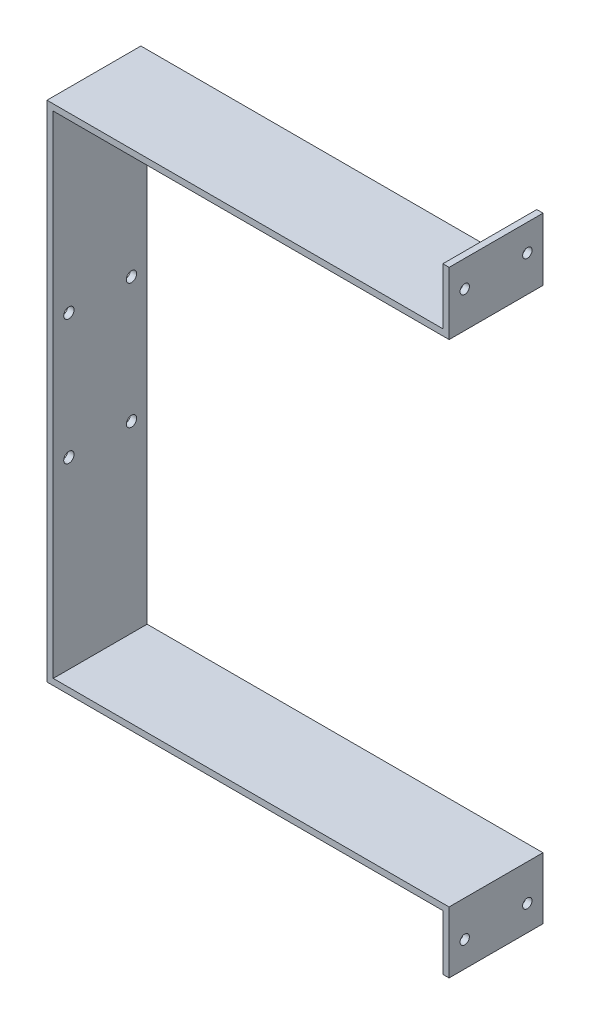
ISO-10303-21;
HEADER;
FILE_DESCRIPTION(('STEP AP214'),'2;1');
FILE_NAME('part.step','',(''),(''),'','','');
FILE_SCHEMA(('AUTOMOTIVE_DESIGN { 1 0 10303 214 1 1 1 1 }'));
ENDSEC;
DATA;
#1=APPLICATION_CONTEXT('core data for automotive mechanical design processes');
#2=APPLICATION_PROTOCOL_DEFINITION('international standard','automotive_design',2000,#1);
#3=PRODUCT_CONTEXT('',#1,'mechanical');
#4=PRODUCT('Part','Part','',(#3));
#5=PRODUCT_RELATED_PRODUCT_CATEGORY('part','',(#4));
#6=PRODUCT_DEFINITION_FORMATION('','',#4);
#7=PRODUCT_DEFINITION_CONTEXT('part definition',#1,'design');
#8=PRODUCT_DEFINITION('design','',#6,#7);
#9=PRODUCT_DEFINITION_SHAPE('','',#8);
#10=(LENGTH_UNIT() NAMED_UNIT(*) SI_UNIT(.MILLI.,.METRE.));
#11=(NAMED_UNIT(*) PLANE_ANGLE_UNIT() SI_UNIT($,.RADIAN.));
#12=(NAMED_UNIT(*) SI_UNIT($,.STERADIAN.) SOLID_ANGLE_UNIT());
#13=UNCERTAINTY_MEASURE_WITH_UNIT(LENGTH_MEASURE(1.E-05),#10,'distance_accuracy_value','');
#14=(GEOMETRIC_REPRESENTATION_CONTEXT(3) GLOBAL_UNCERTAINTY_ASSIGNED_CONTEXT((#13)) GLOBAL_UNIT_ASSIGNED_CONTEXT((#10,
#11,#12)) REPRESENTATION_CONTEXT('',''));
#15=CARTESIAN_POINT('',(0.,0.,0.));
#16=DIRECTION('',(0.,0.,1.));
#17=DIRECTION('',(1.,0.,0.));
#18=AXIS2_PLACEMENT_3D('',#15,#16,#17);
#19=CARTESIAN_POINT('',(0.,0.,30.));
#20=DIRECTION('',(0.,1.,0.));
#21=DIRECTION('',(0.,0.,1.));
#22=AXIS2_PLACEMENT_3D('',#19,#20,#21);
#23=PLANE('',#22);
#24=DIRECTION('',(1.,0.,0.));
#25=VECTOR('',#24,1.);
#26=CARTESIAN_POINT('',(0.,0.,0.));
#27=LINE('',#26,#25);
#28=CARTESIAN_POINT('',(0.,0.,0.));
#29=VERTEX_POINT('',#28);
#30=CARTESIAN_POINT('',(126.5,0.,0.));
#31=VERTEX_POINT('',#30);
#32=EDGE_CURVE('E175',#29,#31,#27,.T.);
#33=ORIENTED_EDGE('',*,*,#32,.T.);
#34=DIRECTION('',(0.,0.,-1.));
#35=VECTOR('',#34,1.);
#36=CARTESIAN_POINT('',(126.5,0.,30.));
#37=LINE('',#36,#35);
#38=CARTESIAN_POINT('',(126.5,0.,30.));
#39=VERTEX_POINT('',#38);
#40=EDGE_CURVE('E11',#39,#31,#37,.T.);
#41=ORIENTED_EDGE('',*,*,#40,.F.);
#42=DIRECTION('',(1.,0.,0.));
#43=VECTOR('',#42,1.);
#44=CARTESIAN_POINT('',(0.,0.,30.));
#45=LINE('',#44,#43);
#46=CARTESIAN_POINT('',(0.,0.,30.));
#47=VERTEX_POINT('',#46);
#48=EDGE_CURVE('E210',#47,#39,#45,.T.);
#49=ORIENTED_EDGE('',*,*,#48,.F.);
#50=DIRECTION('',(0.,0.,-1.));
#51=VECTOR('',#50,1.);
#52=CARTESIAN_POINT('',(0.,0.,30.));
#53=LINE('',#52,#51);
#54=EDGE_CURVE('E171',#47,#29,#53,.T.);
#55=ORIENTED_EDGE('',*,*,#54,.T.);
#56=EDGE_LOOP('',(#33,#41,#49,#55));
#57=FACE_BOUND('',#56,.T.);
#58=ADVANCED_FACE('F17',(#57),#23,.F.);
#59=CARTESIAN_POINT('',(126.5,0.,30.));
#60=DIRECTION('',(-1.,0.,0.));
#61=DIRECTION('',(0.,0.,1.));
#62=AXIS2_PLACEMENT_3D('',#59,#60,#61);
#63=PLANE('',#62);
#64=CARTESIAN_POINT('',(126.5,11.5,5.));
#65=DIRECTION('',(-1.,0.,0.));
#66=DIRECTION('',(0.,0.,1.));
#67=AXIS2_PLACEMENT_3D('',#64,#65,#66);
#68=CIRCLE('',#67,1.5);
#69=CARTESIAN_POINT('',(126.5,11.5,6.5));
#70=VERTEX_POINT('',#69);
#71=EDGE_CURVE('E249',#70,#70,#68,.F.);
#72=ORIENTED_EDGE('',*,*,#71,.F.);
#73=EDGE_LOOP('',(#72));
#74=FACE_BOUND('',#73,.T.);
#75=CARTESIAN_POINT('',(126.5,11.5,25.));
#76=DIRECTION('',(-1.,0.,0.));
#77=DIRECTION('',(0.,0.,1.));
#78=AXIS2_PLACEMENT_3D('',#75,#76,#77);
#79=CIRCLE('',#78,1.5);
#80=CARTESIAN_POINT('',(126.5,11.5,26.5));
#81=VERTEX_POINT('',#80);
#82=EDGE_CURVE('E257',#81,#81,#79,.F.);
#83=ORIENTED_EDGE('',*,*,#82,.F.);
#84=EDGE_LOOP('',(#83));
#85=FACE_BOUND('',#84,.T.);
#86=DIRECTION('',(0.,1.,0.));
#87=VECTOR('',#86,1.);
#88=CARTESIAN_POINT('',(126.5,0.,0.));
#89=LINE('',#88,#87);
#90=CARTESIAN_POINT('',(126.5,20.,0.));
#91=VERTEX_POINT('',#90);
#92=EDGE_CURVE('E179',#31,#91,#89,.T.);
#93=ORIENTED_EDGE('',*,*,#92,.T.);
#94=DIRECTION('',(0.,0.,-1.));
#95=VECTOR('',#94,1.);
#96=CARTESIAN_POINT('',(126.5,20.,30.));
#97=LINE('',#96,#95);
#98=CARTESIAN_POINT('',(126.5,20.,30.));
#99=VERTEX_POINT('',#98);
#100=EDGE_CURVE('E27',#99,#91,#97,.T.);
#101=ORIENTED_EDGE('',*,*,#100,.F.);
#102=DIRECTION('',(0.,1.,0.));
#103=VECTOR('',#102,1.);
#104=CARTESIAN_POINT('',(126.5,0.,30.));
#105=LINE('',#104,#103);
#106=EDGE_CURVE('E112',#39,#99,#105,.T.);
#107=ORIENTED_EDGE('',*,*,#106,.F.);
#108=ORIENTED_EDGE('',*,*,#40,.T.);
#109=EDGE_LOOP('',(#93,#101,#107,#108));
#110=FACE_BOUND('',#109,.T.);
#111=ADVANCED_FACE('F409',(#74,#85,#110),#63,.F.);
#112=CARTESIAN_POINT('',(124.5,20.,30.));
#113=DIRECTION('',(0.,-1.,0.));
#114=DIRECTION('',(0.,0.,-1.));
#115=AXIS2_PLACEMENT_3D('',#112,#113,#114);
#116=PLANE('',#115);
#117=DIRECTION('',(-1.,0.,0.));
#118=VECTOR('',#117,1.);
#119=CARTESIAN_POINT('',(124.5,20.,0.));
#120=LINE('',#119,#118);
#121=CARTESIAN_POINT('',(124.5,20.,0.));
#122=VERTEX_POINT('',#121);
#123=EDGE_CURVE('E183',#91,#122,#120,.T.);
#124=ORIENTED_EDGE('',*,*,#123,.T.);
#125=DIRECTION('',(0.,0.,-1.));
#126=VECTOR('',#125,1.);
#127=CARTESIAN_POINT('',(124.5,20.,30.));
#128=LINE('',#127,#126);
#129=CARTESIAN_POINT('',(124.5,20.,30.));
#130=VERTEX_POINT('',#129);
#131=EDGE_CURVE('E237',#130,#122,#128,.T.);
#132=ORIENTED_EDGE('',*,*,#131,.F.);
#133=DIRECTION('',(-1.,0.,0.));
#134=VECTOR('',#133,1.);
#135=CARTESIAN_POINT('',(124.5,20.,30.));
#136=LINE('',#135,#134);
#137=EDGE_CURVE('E312',#99,#130,#136,.T.);
#138=ORIENTED_EDGE('',*,*,#137,.F.);
#139=ORIENTED_EDGE('',*,*,#100,.T.);
#140=EDGE_LOOP('',(#124,#132,#138,#139));
#141=FACE_BOUND('',#140,.T.);
#142=ADVANCED_FACE('F378',(#141),#116,.F.);
#143=CARTESIAN_POINT('',(124.5,2.,30.));
#144=DIRECTION('',(1.,0.,0.));
#145=DIRECTION('',(0.,0.,-1.));
#146=AXIS2_PLACEMENT_3D('',#143,#144,#145);
#147=PLANE('',#146);
#148=CARTESIAN_POINT('',(124.5,11.5,5.));
#149=DIRECTION('',(1.,0.,0.));
#150=DIRECTION('',(0.,0.,-1.));
#151=AXIS2_PLACEMENT_3D('',#148,#149,#150);
#152=CIRCLE('',#151,1.5);
#153=CARTESIAN_POINT('',(124.5,11.5,3.5));
#154=VERTEX_POINT('',#153);
#155=EDGE_CURVE('E20',#154,#154,#152,.F.);
#156=ORIENTED_EDGE('',*,*,#155,.F.);
#157=EDGE_LOOP('',(#156));
#158=FACE_BOUND('',#157,.T.);
#159=CARTESIAN_POINT('',(124.5,11.5,25.));
#160=DIRECTION('',(1.,0.,0.));
#161=DIRECTION('',(0.,0.,-1.));
#162=AXIS2_PLACEMENT_3D('',#159,#160,#161);
#163=CIRCLE('',#162,1.5);
#164=CARTESIAN_POINT('',(124.5,11.5,23.5));
#165=VERTEX_POINT('',#164);
#166=EDGE_CURVE('E254',#165,#165,#163,.F.);
#167=ORIENTED_EDGE('',*,*,#166,.F.);
#168=EDGE_LOOP('',(#167));
#169=FACE_BOUND('',#168,.T.);
#170=DIRECTION('',(0.,-1.,0.));
#171=VECTOR('',#170,1.);
#172=CARTESIAN_POINT('',(124.5,2.,0.));
#173=LINE('',#172,#171);
#174=CARTESIAN_POINT('',(124.5,2.,0.));
#175=VERTEX_POINT('',#174);
#176=EDGE_CURVE('E186',#122,#175,#173,.T.);
#177=ORIENTED_EDGE('',*,*,#176,.T.);
#178=DIRECTION('',(0.,0.,-1.));
#179=VECTOR('',#178,1.);
#180=CARTESIAN_POINT('',(124.5,2.,30.));
#181=LINE('',#180,#179);
#182=CARTESIAN_POINT('',(124.5,2.,30.));
#183=VERTEX_POINT('',#182);
#184=EDGE_CURVE('E233',#183,#175,#181,.T.);
#185=ORIENTED_EDGE('',*,*,#184,.F.);
#186=DIRECTION('',(0.,-1.,0.));
#187=VECTOR('',#186,1.);
#188=CARTESIAN_POINT('',(124.5,2.,30.));
#189=LINE('',#188,#187);
#190=EDGE_CURVE('E315',#130,#183,#189,.T.);
#191=ORIENTED_EDGE('',*,*,#190,.F.);
#192=ORIENTED_EDGE('',*,*,#131,.T.);
#193=EDGE_LOOP('',(#177,#185,#191,#192));
#194=FACE_BOUND('',#193,.T.);
#195=ADVANCED_FACE('F374',(#158,#169,#194),#147,.F.);
#196=CARTESIAN_POINT('',(-2.,2.,30.));
#197=DIRECTION('',(0.,-1.,0.));
#198=DIRECTION('',(0.,0.,-1.));
#199=AXIS2_PLACEMENT_3D('',#196,#197,#198);
#200=PLANE('',#199);
#201=DIRECTION('',(-1.,0.,0.));
#202=VECTOR('',#201,1.);
#203=CARTESIAN_POINT('',(-2.,2.,0.));
#204=LINE('',#203,#202);
#205=CARTESIAN_POINT('',(-2.,2.,0.));
#206=VERTEX_POINT('',#205);
#207=EDGE_CURVE('E189',#175,#206,#204,.T.);
#208=ORIENTED_EDGE('',*,*,#207,.T.);
#209=DIRECTION('',(0.,0.,-1.));
#210=VECTOR('',#209,1.);
#211=CARTESIAN_POINT('',(-2.,2.,30.));
#212=LINE('',#211,#210);
#213=CARTESIAN_POINT('',(-2.,2.,30.));
#214=VERTEX_POINT('',#213);
#215=EDGE_CURVE('E229',#214,#206,#212,.T.);
#216=ORIENTED_EDGE('',*,*,#215,.F.);
#217=DIRECTION('',(-1.,0.,0.));
#218=VECTOR('',#217,1.);
#219=CARTESIAN_POINT('',(-2.,2.,30.));
#220=LINE('',#219,#218);
#221=EDGE_CURVE('E318',#183,#214,#220,.T.);
#222=ORIENTED_EDGE('',*,*,#221,.F.);
#223=ORIENTED_EDGE('',*,*,#184,.T.);
#224=EDGE_LOOP('',(#208,#216,#222,#223));
#225=FACE_BOUND('',#224,.T.);
#226=ADVANCED_FACE('F377',(#225),#200,.F.);
#227=CARTESIAN_POINT('',(-2.,2.,30.));
#228=DIRECTION('',(1.,0.,0.));
#229=DIRECTION('',(0.,1.,0.));
#230=AXIS2_PLACEMENT_3D('',#227,#228,#229);
#231=PLANE('',#230);
#232=CARTESIAN_POINT('',(-2.,-98.3324832100896,25.));
#233=DIRECTION('',(1.,0.,0.));
#234=DIRECTION('',(0.,1.,0.));
#235=AXIS2_PLACEMENT_3D('',#232,#233,#234);
#236=CIRCLE('',#235,1.65);
#237=CARTESIAN_POINT('',(-2.,-96.6824832100896,25.));
#238=VERTEX_POINT('',#237);
#239=EDGE_CURVE('E297',#238,#238,#236,.T.);
#240=ORIENTED_EDGE('',*,*,#239,.T.);
#241=EDGE_LOOP('',(#240));
#242=FACE_BOUND('',#241,.T.);
#243=CARTESIAN_POINT('',(-2.,-58.3324832100896,25.));
#244=DIRECTION('',(1.,0.,0.));
#245=DIRECTION('',(0.,1.,0.));
#246=AXIS2_PLACEMENT_3D('',#243,#244,#245);
#247=CIRCLE('',#246,1.65);
#248=CARTESIAN_POINT('',(-2.,-56.6824832100896,25.));
#249=VERTEX_POINT('',#248);
#250=EDGE_CURVE('E293',#249,#249,#247,.T.);
#251=ORIENTED_EDGE('',*,*,#250,.T.);
#252=EDGE_LOOP('',(#251));
#253=FACE_BOUND('',#252,.T.);
#254=CARTESIAN_POINT('',(-2.,-58.3324832100896,5.));
#255=DIRECTION('',(1.,0.,0.));
#256=DIRECTION('',(0.,1.,0.));
#257=AXIS2_PLACEMENT_3D('',#254,#255,#256);
#258=CIRCLE('',#257,1.65);
#259=CARTESIAN_POINT('',(-2.,-56.6824832100896,5.));
#260=VERTEX_POINT('',#259);
#261=EDGE_CURVE('E282',#260,#260,#258,.T.);
#262=ORIENTED_EDGE('',*,*,#261,.T.);
#263=EDGE_LOOP('',(#262));
#264=FACE_BOUND('',#263,.T.);
#265=CARTESIAN_POINT('',(-2.,-98.3324832100896,5.));
#266=DIRECTION('',(1.,0.,0.));
#267=DIRECTION('',(0.,1.,0.));
#268=AXIS2_PLACEMENT_3D('',#265,#266,#267);
#269=CIRCLE('',#268,1.65);
#270=CARTESIAN_POINT('',(-2.,-96.6824832100896,5.));
#271=VERTEX_POINT('',#270);
#272=EDGE_CURVE('E180',#271,#271,#269,.T.);
#273=ORIENTED_EDGE('',*,*,#272,.T.);
#274=EDGE_LOOP('',(#273));
#275=FACE_BOUND('',#274,.T.);
#276=DIRECTION('',(0.,-1.,0.));
#277=VECTOR('',#276,1.);
#278=CARTESIAN_POINT('',(-2.,2.,0.));
#279=LINE('',#278,#277);
#280=CARTESIAN_POINT('',(-2.,-159.,0.));
#281=VERTEX_POINT('',#280);
#282=EDGE_CURVE('E192',#206,#281,#279,.T.);
#283=ORIENTED_EDGE('',*,*,#282,.T.);
#284=DIRECTION('',(0.,0.,-1.));
#285=VECTOR('',#284,1.);
#286=CARTESIAN_POINT('',(-2.,-159.,30.));
#287=LINE('',#286,#285);
#288=CARTESIAN_POINT('',(-2.,-159.,30.));
#289=VERTEX_POINT('',#288);
#290=EDGE_CURVE('E225',#289,#281,#287,.T.);
#291=ORIENTED_EDGE('',*,*,#290,.F.);
#292=DIRECTION('',(0.,-1.,0.));
#293=VECTOR('',#292,1.);
#294=CARTESIAN_POINT('',(-2.,2.,30.));
#295=LINE('',#294,#293);
#296=EDGE_CURVE('E321',#214,#289,#295,.T.);
#297=ORIENTED_EDGE('',*,*,#296,.F.);
#298=ORIENTED_EDGE('',*,*,#215,.T.);
#299=EDGE_LOOP('',(#283,#291,#297,#298));
#300=FACE_BOUND('',#299,.T.);
#301=ADVANCED_FACE('F398',(#242,#253,#264,#275,#300),#231,.F.);
#302=CARTESIAN_POINT('',(-2.,-159.,30.));
#303=DIRECTION('',(0.,1.,0.));
#304=DIRECTION('',(0.,0.,1.));
#305=AXIS2_PLACEMENT_3D('',#302,#303,#304);
#306=PLANE('',#305);
#307=DIRECTION('',(1.,0.,0.));
#308=VECTOR('',#307,1.);
#309=CARTESIAN_POINT('',(-2.,-159.,0.));
#310=LINE('',#309,#308);
#311=CARTESIAN_POINT('',(124.48,-159.,0.));
#312=VERTEX_POINT('',#311);
#313=EDGE_CURVE('E195',#281,#312,#310,.T.);
#314=ORIENTED_EDGE('',*,*,#313,.T.);
#315=DIRECTION('',(0.,0.,-1.));
#316=VECTOR('',#315,1.);
#317=CARTESIAN_POINT('',(124.48,-159.,30.));
#318=LINE('',#317,#316);
#319=CARTESIAN_POINT('',(124.48,-159.,30.));
#320=VERTEX_POINT('',#319);
#321=EDGE_CURVE('E221',#320,#312,#318,.T.);
#322=ORIENTED_EDGE('',*,*,#321,.F.);
#323=DIRECTION('',(1.,0.,0.));
#324=VECTOR('',#323,1.);
#325=CARTESIAN_POINT('',(-2.,-159.,30.));
#326=LINE('',#325,#324);
#327=EDGE_CURVE('E324',#289,#320,#326,.T.);
#328=ORIENTED_EDGE('',*,*,#327,.F.);
#329=ORIENTED_EDGE('',*,*,#290,.T.);
#330=EDGE_LOOP('',(#314,#322,#328,#329));
#331=FACE_BOUND('',#330,.T.);
#332=ADVANCED_FACE('F402',(#331),#306,.F.);
#333=CARTESIAN_POINT('',(124.48,-159.,30.));
#334=DIRECTION('',(1.,0.,0.));
#335=DIRECTION('',(0.,0.,-1.));
#336=AXIS2_PLACEMENT_3D('',#333,#334,#335);
#337=PLANE('',#336);
#338=CARTESIAN_POINT('',(124.48,-168.5,25.));
#339=DIRECTION('',(1.,0.,0.));
#340=DIRECTION('',(0.,0.,-1.));
#341=AXIS2_PLACEMENT_3D('',#338,#339,#340);
#342=CIRCLE('',#341,1.5);
#343=CARTESIAN_POINT('',(124.48,-168.5,23.5));
#344=VERTEX_POINT('',#343);
#345=EDGE_CURVE('E253',#344,#344,#342,.F.);
#346=ORIENTED_EDGE('',*,*,#345,.F.);
#347=EDGE_LOOP('',(#346));
#348=FACE_BOUND('',#347,.T.);
#349=CARTESIAN_POINT('',(124.48,-168.5,5.));
#350=DIRECTION('',(1.,0.,0.));
#351=DIRECTION('',(0.,0.,-1.));
#352=AXIS2_PLACEMENT_3D('',#349,#350,#351);
#353=CIRCLE('',#352,1.5);
#354=CARTESIAN_POINT('',(124.48,-168.5,3.5));
#355=VERTEX_POINT('',#354);
#356=EDGE_CURVE('E248',#355,#355,#353,.F.);
#357=ORIENTED_EDGE('',*,*,#356,.F.);
#358=EDGE_LOOP('',(#357));
#359=FACE_BOUND('',#358,.T.);
#360=DIRECTION('',(0.,-1.,0.));
#361=VECTOR('',#360,1.);
#362=CARTESIAN_POINT('',(124.48,-159.,0.));
#363=LINE('',#362,#361);
#364=CARTESIAN_POINT('',(124.48,-176.664966420179,0.));
#365=VERTEX_POINT('',#364);
#366=EDGE_CURVE('E198',#312,#365,#363,.T.);
#367=ORIENTED_EDGE('',*,*,#366,.T.);
#368=DIRECTION('',(0.,0.,-1.));
#369=VECTOR('',#368,1.);
#370=CARTESIAN_POINT('',(124.48,-176.664966420179,30.));
#371=LINE('',#370,#369);
#372=CARTESIAN_POINT('',(124.48,-176.664966420179,30.));
#373=VERTEX_POINT('',#372);
#374=EDGE_CURVE('E217',#373,#365,#371,.T.);
#375=ORIENTED_EDGE('',*,*,#374,.F.);
#376=DIRECTION('',(0.,-1.,0.));
#377=VECTOR('',#376,1.);
#378=CARTESIAN_POINT('',(124.48,-159.,30.));
#379=LINE('',#378,#377);
#380=EDGE_CURVE('E327',#320,#373,#379,.T.);
#381=ORIENTED_EDGE('',*,*,#380,.F.);
#382=ORIENTED_EDGE('',*,*,#321,.T.);
#383=EDGE_LOOP('',(#367,#375,#381,#382));
#384=FACE_BOUND('',#383,.T.);
#385=ADVANCED_FACE('F417',(#348,#359,#384),#337,.F.);
#386=CARTESIAN_POINT('',(124.48,-176.664966420179,30.));
#387=DIRECTION('',(0.,1.,0.));
#388=DIRECTION('',(0.,0.,1.));
#389=AXIS2_PLACEMENT_3D('',#386,#387,#388);
#390=PLANE('',#389);
#391=DIRECTION('',(1.,0.,0.));
#392=VECTOR('',#391,1.);
#393=CARTESIAN_POINT('',(124.48,-176.664966420179,0.));
#394=LINE('',#393,#392);
#395=CARTESIAN_POINT('',(126.48,-176.664966420179,0.));
#396=VERTEX_POINT('',#395);
#397=EDGE_CURVE('E201',#365,#396,#394,.T.);
#398=ORIENTED_EDGE('',*,*,#397,.T.);
#399=DIRECTION('',(0.,0.,-1.));
#400=VECTOR('',#399,1.);
#401=CARTESIAN_POINT('',(126.48,-176.664966420179,30.));
#402=LINE('',#401,#400);
#403=CARTESIAN_POINT('',(126.48,-176.664966420179,30.));
#404=VERTEX_POINT('',#403);
#405=EDGE_CURVE('E163',#404,#396,#402,.T.);
#406=ORIENTED_EDGE('',*,*,#405,.F.);
#407=DIRECTION('',(1.,0.,0.));
#408=VECTOR('',#407,1.);
#409=CARTESIAN_POINT('',(124.48,-176.664966420179,30.));
#410=LINE('',#409,#408);
#411=EDGE_CURVE('E152',#373,#404,#410,.T.);
#412=ORIENTED_EDGE('',*,*,#411,.F.);
#413=ORIENTED_EDGE('',*,*,#374,.T.);
#414=EDGE_LOOP('',(#398,#406,#412,#413));
#415=FACE_BOUND('',#414,.T.);
#416=ADVANCED_FACE('F415',(#415),#390,.F.);
#417=CARTESIAN_POINT('',(126.48,-157.,30.));
#418=DIRECTION('',(-1.,0.,0.));
#419=DIRECTION('',(0.,0.,1.));
#420=AXIS2_PLACEMENT_3D('',#417,#418,#419);
#421=PLANE('',#420);
#422=CARTESIAN_POINT('',(126.48,-168.5,25.));
#423=DIRECTION('',(-1.,0.,0.));
#424=DIRECTION('',(0.,0.,1.));
#425=AXIS2_PLACEMENT_3D('',#422,#423,#424);
#426=CIRCLE('',#425,1.5);
#427=CARTESIAN_POINT('',(126.48,-168.5,26.5));
#428=VERTEX_POINT('',#427);
#429=EDGE_CURVE('E250',#428,#428,#426,.F.);
#430=ORIENTED_EDGE('',*,*,#429,.F.);
#431=EDGE_LOOP('',(#430));
#432=FACE_BOUND('',#431,.T.);
#433=CARTESIAN_POINT('',(126.48,-168.5,5.));
#434=DIRECTION('',(-1.,0.,0.));
#435=DIRECTION('',(0.,0.,1.));
#436=AXIS2_PLACEMENT_3D('',#433,#434,#435);
#437=CIRCLE('',#436,1.5);
#438=CARTESIAN_POINT('',(126.48,-168.5,6.5));
#439=VERTEX_POINT('',#438);
#440=EDGE_CURVE('E244',#439,#439,#437,.F.);
#441=ORIENTED_EDGE('',*,*,#440,.F.);
#442=EDGE_LOOP('',(#441));
#443=FACE_BOUND('',#442,.T.);
#444=DIRECTION('',(0.,1.,0.));
#445=VECTOR('',#444,1.);
#446=CARTESIAN_POINT('',(126.48,-157.,0.));
#447=LINE('',#446,#445);
#448=CARTESIAN_POINT('',(126.48,-157.,0.));
#449=VERTEX_POINT('',#448);
#450=EDGE_CURVE('E161',#396,#449,#447,.T.);
#451=ORIENTED_EDGE('',*,*,#450,.T.);
#452=DIRECTION('',(0.,0.,-1.));
#453=VECTOR('',#452,1.);
#454=CARTESIAN_POINT('',(126.48,-157.,30.));
#455=LINE('',#454,#453);
#456=CARTESIAN_POINT('',(126.48,-157.,30.));
#457=VERTEX_POINT('',#456);
#458=EDGE_CURVE('E158',#457,#449,#455,.T.);
#459=ORIENTED_EDGE('',*,*,#458,.F.);
#460=DIRECTION('',(0.,1.,0.));
#461=VECTOR('',#460,1.);
#462=CARTESIAN_POINT('',(126.48,-157.,30.));
#463=LINE('',#462,#461);
#464=EDGE_CURVE('E146',#404,#457,#463,.T.);
#465=ORIENTED_EDGE('',*,*,#464,.F.);
#466=ORIENTED_EDGE('',*,*,#405,.T.);
#467=EDGE_LOOP('',(#451,#459,#465,#466));
#468=FACE_BOUND('',#467,.T.);
#469=ADVANCED_FACE('F159',(#432,#443,#468),#421,.F.);
#470=CARTESIAN_POINT('',(0.,-157.,30.));
#471=DIRECTION('',(0.,-1.,0.));
#472=DIRECTION('',(0.,0.,-1.));
#473=AXIS2_PLACEMENT_3D('',#470,#471,#472);
#474=PLANE('',#473);
#475=DIRECTION('',(-1.,0.,0.));
#476=VECTOR('',#475,1.);
#477=CARTESIAN_POINT('',(0.,-157.,0.));
#478=LINE('',#477,#476);
#479=CARTESIAN_POINT('',(0.,-157.,0.));
#480=VERTEX_POINT('',#479);
#481=EDGE_CURVE('E94',#449,#480,#478,.T.);
#482=ORIENTED_EDGE('',*,*,#481,.T.);
#483=DIRECTION('',(0.,0.,-1.));
#484=VECTOR('',#483,1.);
#485=CARTESIAN_POINT('',(0.,-157.,30.));
#486=LINE('',#485,#484);
#487=CARTESIAN_POINT('',(0.,-157.,30.));
#488=VERTEX_POINT('',#487);
#489=EDGE_CURVE('E164',#488,#480,#486,.T.);
#490=ORIENTED_EDGE('',*,*,#489,.F.);
#491=DIRECTION('',(-1.,0.,0.));
#492=VECTOR('',#491,1.);
#493=CARTESIAN_POINT('',(0.,-157.,30.));
#494=LINE('',#493,#492);
#495=EDGE_CURVE('E150',#457,#488,#494,.T.);
#496=ORIENTED_EDGE('',*,*,#495,.F.);
#497=ORIENTED_EDGE('',*,*,#458,.T.);
#498=EDGE_LOOP('',(#482,#490,#496,#497));
#499=FACE_BOUND('',#498,.T.);
#500=ADVANCED_FACE('F166',(#499),#474,.F.);
#501=CARTESIAN_POINT('',(0.,0.,30.));
#502=DIRECTION('',(-1.,0.,0.));
#503=DIRECTION('',(0.,-1.,0.));
#504=AXIS2_PLACEMENT_3D('',#501,#502,#503);
#505=PLANE('',#504);
#506=CARTESIAN_POINT('',(0.,-98.3324832100896,25.));
#507=DIRECTION('',(1.,0.,0.));
#508=DIRECTION('',(0.,0.,-1.));
#509=AXIS2_PLACEMENT_3D('',#506,#507,#508);
#510=CIRCLE('',#509,1.65);
#511=CARTESIAN_POINT('',(0.,-98.3324832100896,23.35));
#512=VERTEX_POINT('',#511);
#513=EDGE_CURVE('E278',#512,#512,#510,.T.);
#514=ORIENTED_EDGE('',*,*,#513,.F.);
#515=EDGE_LOOP('',(#514));
#516=FACE_BOUND('',#515,.T.);
#517=CARTESIAN_POINT('',(0.,-58.3324832100896,25.));
#518=DIRECTION('',(1.,0.,0.));
#519=DIRECTION('',(0.,0.,-1.));
#520=AXIS2_PLACEMENT_3D('',#517,#518,#519);
#521=CIRCLE('',#520,1.65);
#522=CARTESIAN_POINT('',(0.,-58.3324832100896,23.35));
#523=VERTEX_POINT('',#522);
#524=EDGE_CURVE('E283',#523,#523,#521,.T.);
#525=ORIENTED_EDGE('',*,*,#524,.F.);
#526=EDGE_LOOP('',(#525));
#527=FACE_BOUND('',#526,.T.);
#528=CARTESIAN_POINT('',(0.,-58.3324832100896,5.));
#529=DIRECTION('',(1.,0.,0.));
#530=DIRECTION('',(0.,0.,-1.));
#531=AXIS2_PLACEMENT_3D('',#528,#529,#530);
#532=CIRCLE('',#531,1.65);
#533=CARTESIAN_POINT('',(0.,-58.3324832100896,3.35));
#534=VERTEX_POINT('',#533);
#535=EDGE_CURVE('E277',#534,#534,#532,.T.);
#536=ORIENTED_EDGE('',*,*,#535,.F.);
#537=EDGE_LOOP('',(#536));
#538=FACE_BOUND('',#537,.T.);
#539=CARTESIAN_POINT('',(0.,-98.3324832100896,5.));
#540=DIRECTION('',(1.,0.,0.));
#541=DIRECTION('',(0.,0.,-1.));
#542=AXIS2_PLACEMENT_3D('',#539,#540,#541);
#543=CIRCLE('',#542,1.65);
#544=CARTESIAN_POINT('',(0.,-98.3324832100896,3.35));
#545=VERTEX_POINT('',#544);
#546=EDGE_CURVE('E301',#545,#545,#543,.T.);
#547=ORIENTED_EDGE('',*,*,#546,.F.);
#548=EDGE_LOOP('',(#547));
#549=FACE_BOUND('',#548,.T.);
#550=DIRECTION('',(0.,1.,0.));
#551=VECTOR('',#550,1.);
#552=CARTESIAN_POINT('',(0.,0.,0.));
#553=LINE('',#552,#551);
#554=EDGE_CURVE('E102',#480,#29,#553,.T.);
#555=ORIENTED_EDGE('',*,*,#554,.T.);
#556=ORIENTED_EDGE('',*,*,#54,.F.);
#557=DIRECTION('',(0.,1.,0.));
#558=VECTOR('',#557,1.);
#559=CARTESIAN_POINT('',(0.,0.,30.));
#560=LINE('',#559,#558);
#561=EDGE_CURVE('E40',#488,#47,#560,.T.);
#562=ORIENTED_EDGE('',*,*,#561,.F.);
#563=ORIENTED_EDGE('',*,*,#489,.T.);
#564=EDGE_LOOP('',(#555,#556,#562,#563));
#565=FACE_BOUND('',#564,.T.);
#566=ADVANCED_FACE('F412',(#516,#527,#538,#549,#565),#505,.F.);
#567=CARTESIAN_POINT('',(0.,0.,30.));
#568=DIRECTION('',(0.,0.,1.));
#569=DIRECTION('',(1.,0.,0.));
#570=AXIS2_PLACEMENT_3D('',#567,#568,#569);
#571=PLANE('',#570);
#572=ORIENTED_EDGE('',*,*,#48,.T.);
#573=ORIENTED_EDGE('',*,*,#106,.T.);
#574=ORIENTED_EDGE('',*,*,#137,.T.);
#575=ORIENTED_EDGE('',*,*,#190,.T.);
#576=ORIENTED_EDGE('',*,*,#221,.T.);
#577=ORIENTED_EDGE('',*,*,#296,.T.);
#578=ORIENTED_EDGE('',*,*,#327,.T.);
#579=ORIENTED_EDGE('',*,*,#380,.T.);
#580=ORIENTED_EDGE('',*,*,#411,.T.);
#581=ORIENTED_EDGE('',*,*,#464,.T.);
#582=ORIENTED_EDGE('',*,*,#495,.T.);
#583=ORIENTED_EDGE('',*,*,#561,.T.);
#584=EDGE_LOOP('',(#572,#573,#574,#575,#576,#577,#578,#579,#580,#581,#582,#583));
#585=FACE_BOUND('',#584,.T.);
#586=ADVANCED_FACE('F148',(#585),#571,.T.);
#587=CARTESIAN_POINT('',(0.,0.,0.));
#588=DIRECTION('',(0.,0.,1.));
#589=DIRECTION('',(1.,0.,0.));
#590=AXIS2_PLACEMENT_3D('',#587,#588,#589);
#591=PLANE('',#590);
#592=ORIENTED_EDGE('',*,*,#32,.F.);
#593=ORIENTED_EDGE('',*,*,#554,.F.);
#594=ORIENTED_EDGE('',*,*,#481,.F.);
#595=ORIENTED_EDGE('',*,*,#450,.F.);
#596=ORIENTED_EDGE('',*,*,#397,.F.);
#597=ORIENTED_EDGE('',*,*,#366,.F.);
#598=ORIENTED_EDGE('',*,*,#313,.F.);
#599=ORIENTED_EDGE('',*,*,#282,.F.);
#600=ORIENTED_EDGE('',*,*,#207,.F.);
#601=ORIENTED_EDGE('',*,*,#176,.F.);
#602=ORIENTED_EDGE('',*,*,#123,.F.);
#603=ORIENTED_EDGE('',*,*,#92,.F.);
#604=EDGE_LOOP('',(#592,#593,#594,#595,#596,#597,#598,#599,#600,#601,#602,#603));
#605=FACE_BOUND('',#604,.T.);
#606=ADVANCED_FACE('F393',(#605),#591,.F.);
#607=CARTESIAN_POINT('',(-40.,-98.3324832100896,5.));
#608=DIRECTION('',(1.,0.,0.));
#609=DIRECTION('',(0.,0.,-1.));
#610=AXIS2_PLACEMENT_3D('',#607,#608,#609);
#611=CYLINDRICAL_SURFACE('',#610,1.65);
#612=ORIENTED_EDGE('',*,*,#546,.T.);
#613=EDGE_LOOP('',(#612));
#614=FACE_BOUND('',#613,.T.);
#615=ORIENTED_EDGE('',*,*,#272,.F.);
#616=EDGE_LOOP('',(#615));
#617=FACE_BOUND('',#616,.T.);
#618=ADVANCED_FACE('F455',(#614,#617),#611,.F.);
#619=CARTESIAN_POINT('',(-40.,-58.3324832100896,5.));
#620=DIRECTION('',(1.,0.,0.));
#621=DIRECTION('',(0.,0.,-1.));
#622=AXIS2_PLACEMENT_3D('',#619,#620,#621);
#623=CYLINDRICAL_SURFACE('',#622,1.65);
#624=ORIENTED_EDGE('',*,*,#535,.T.);
#625=EDGE_LOOP('',(#624));
#626=FACE_BOUND('',#625,.T.);
#627=ORIENTED_EDGE('',*,*,#261,.F.);
#628=EDGE_LOOP('',(#627));
#629=FACE_BOUND('',#628,.T.);
#630=ADVANCED_FACE('F457',(#626,#629),#623,.F.);
#631=CARTESIAN_POINT('',(-40.,-58.3324832100896,25.));
#632=DIRECTION('',(1.,0.,0.));
#633=DIRECTION('',(0.,0.,-1.));
#634=AXIS2_PLACEMENT_3D('',#631,#632,#633);
#635=CYLINDRICAL_SURFACE('',#634,1.65);
#636=ORIENTED_EDGE('',*,*,#524,.T.);
#637=EDGE_LOOP('',(#636));
#638=FACE_BOUND('',#637,.T.);
#639=ORIENTED_EDGE('',*,*,#250,.F.);
#640=EDGE_LOOP('',(#639));
#641=FACE_BOUND('',#640,.T.);
#642=ADVANCED_FACE('F464',(#638,#641),#635,.F.);
#643=CARTESIAN_POINT('',(-40.,-98.3324832100896,25.));
#644=DIRECTION('',(1.,0.,0.));
#645=DIRECTION('',(0.,0.,-1.));
#646=AXIS2_PLACEMENT_3D('',#643,#644,#645);
#647=CYLINDRICAL_SURFACE('',#646,1.65);
#648=ORIENTED_EDGE('',*,*,#513,.T.);
#649=EDGE_LOOP('',(#648));
#650=FACE_BOUND('',#649,.T.);
#651=ORIENTED_EDGE('',*,*,#239,.F.);
#652=EDGE_LOOP('',(#651));
#653=FACE_BOUND('',#652,.T.);
#654=ADVANCED_FACE('F489',(#650,#653),#647,.F.);
#655=CARTESIAN_POINT('',(114.5,-168.5,5.));
#656=DIRECTION('',(1.,0.,0.));
#657=DIRECTION('',(0.,0.,-1.));
#658=AXIS2_PLACEMENT_3D('',#655,#656,#657);
#659=CYLINDRICAL_SURFACE('',#658,1.5);
#660=ORIENTED_EDGE('',*,*,#440,.T.);
#661=EDGE_LOOP('',(#660));
#662=FACE_BOUND('',#661,.T.);
#663=ORIENTED_EDGE('',*,*,#356,.T.);
#664=EDGE_LOOP('',(#663));
#665=FACE_BOUND('',#664,.T.);
#666=ADVANCED_FACE('F485',(#662,#665),#659,.F.);
#667=CARTESIAN_POINT('',(114.5,-168.5,25.));
#668=DIRECTION('',(1.,0.,0.));
#669=DIRECTION('',(0.,0.,-1.));
#670=AXIS2_PLACEMENT_3D('',#667,#668,#669);
#671=CYLINDRICAL_SURFACE('',#670,1.5);
#672=ORIENTED_EDGE('',*,*,#429,.T.);
#673=EDGE_LOOP('',(#672));
#674=FACE_BOUND('',#673,.T.);
#675=ORIENTED_EDGE('',*,*,#345,.T.);
#676=EDGE_LOOP('',(#675));
#677=FACE_BOUND('',#676,.T.);
#678=ADVANCED_FACE('F488',(#674,#677),#671,.F.);
#679=CARTESIAN_POINT('',(114.5,11.5,25.));
#680=DIRECTION('',(1.,0.,0.));
#681=DIRECTION('',(0.,0.,-1.));
#682=AXIS2_PLACEMENT_3D('',#679,#680,#681);
#683=CYLINDRICAL_SURFACE('',#682,1.5);
#684=ORIENTED_EDGE('',*,*,#166,.T.);
#685=EDGE_LOOP('',(#684));
#686=FACE_BOUND('',#685,.T.);
#687=ORIENTED_EDGE('',*,*,#82,.T.);
#688=EDGE_LOOP('',(#687));
#689=FACE_BOUND('',#688,.T.);
#690=ADVANCED_FACE('F496',(#686,#689),#683,.F.);
#691=CARTESIAN_POINT('',(114.5,11.5,5.));
#692=DIRECTION('',(1.,0.,0.));
#693=DIRECTION('',(0.,0.,-1.));
#694=AXIS2_PLACEMENT_3D('',#691,#692,#693);
#695=CYLINDRICAL_SURFACE('',#694,1.5);
#696=ORIENTED_EDGE('',*,*,#155,.T.);
#697=EDGE_LOOP('',(#696));
#698=FACE_BOUND('',#697,.T.);
#699=ORIENTED_EDGE('',*,*,#71,.T.);
#700=EDGE_LOOP('',(#699));
#701=FACE_BOUND('',#700,.T.);
#702=ADVANCED_FACE('F371',(#698,#701),#695,.F.);
#703=CLOSED_SHELL('',(#58,#111,#142,#195,#226,#301,#332,#385,#416,#469,#500,#566,#586,#606,#618,
#630,#642,#654,#666,#678,#690,#702));
#704=MANIFOLD_SOLID_BREP('B1',#703);
#705=ADVANCED_BREP_SHAPE_REPRESENTATION('',(#18,#704),#14);
#706=SHAPE_DEFINITION_REPRESENTATION(#9,#705);
ENDSEC;
END-ISO-10303-21;
